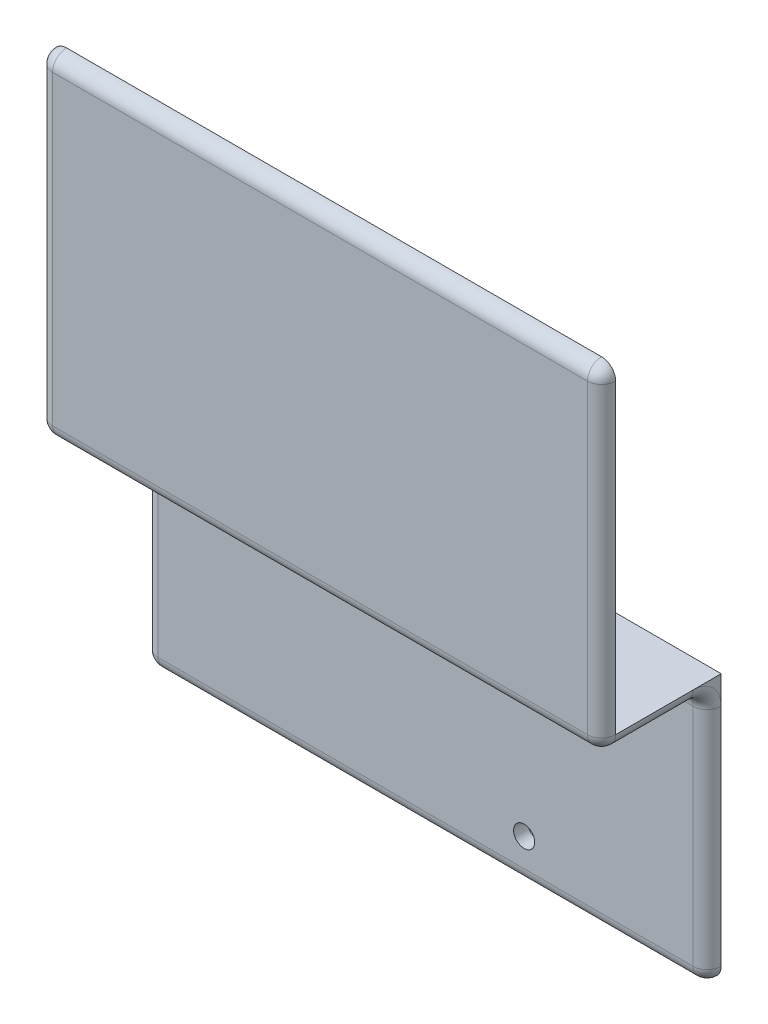
ISO-10303-21;
HEADER;
FILE_DESCRIPTION(('STEP AP214'),'2;1');
FILE_NAME('part.step','',(''),(''),'','','');
FILE_SCHEMA(('AUTOMOTIVE_DESIGN { 1 0 10303 214 1 1 1 1 }'));
ENDSEC;
DATA;
#1=APPLICATION_CONTEXT('core data for automotive mechanical design processes');
#2=APPLICATION_PROTOCOL_DEFINITION('international standard','automotive_design',2000,#1);
#3=PRODUCT_CONTEXT('',#1,'mechanical');
#4=PRODUCT('Part','Part','',(#3));
#5=PRODUCT_RELATED_PRODUCT_CATEGORY('part','',(#4));
#6=PRODUCT_DEFINITION_FORMATION('','',#4);
#7=PRODUCT_DEFINITION_CONTEXT('part definition',#1,'design');
#8=PRODUCT_DEFINITION('design','',#6,#7);
#9=PRODUCT_DEFINITION_SHAPE('','',#8);
#10=(LENGTH_UNIT() NAMED_UNIT(*) SI_UNIT(.MILLI.,.METRE.));
#11=(NAMED_UNIT(*) PLANE_ANGLE_UNIT() SI_UNIT($,.RADIAN.));
#12=(NAMED_UNIT(*) SI_UNIT($,.STERADIAN.) SOLID_ANGLE_UNIT());
#13=UNCERTAINTY_MEASURE_WITH_UNIT(LENGTH_MEASURE(1.E-05),#10,'distance_accuracy_value','');
#14=(GEOMETRIC_REPRESENTATION_CONTEXT(3) GLOBAL_UNCERTAINTY_ASSIGNED_CONTEXT((#13)) GLOBAL_UNIT_ASSIGNED_CONTEXT((#10,
#11,#12)) REPRESENTATION_CONTEXT('',''));
#15=CARTESIAN_POINT('',(0.,0.,0.));
#16=DIRECTION('',(0.,0.,1.));
#17=DIRECTION('',(1.,0.,0.));
#18=AXIS2_PLACEMENT_3D('',#15,#16,#17);
#19=CARTESIAN_POINT('',(40.,-41.75,17.));
#20=DIRECTION('',(-1.,0.,0.));
#21=DIRECTION('',(0.,0.,1.));
#22=AXIS2_PLACEMENT_3D('',#19,#20,#21);
#23=PLANE('',#22);
#24=CARTESIAN_POINT('',(40.,-7.75000000000001,4.));
#25=DIRECTION('',(-1.,0.,0.));
#26=DIRECTION('',(0.,0.,1.));
#27=AXIS2_PLACEMENT_3D('',#24,#25,#26);
#28=CIRCLE('',#27,4.);
#29=CARTESIAN_POINT('',(40.,-7.75000000000001,0.));
#30=VERTEX_POINT('',#29);
#31=CARTESIAN_POINT('',(40.,-3.75,4.));
#32=VERTEX_POINT('',#31);
#33=EDGE_CURVE('E299',#30,#32,#28,.F.);
#34=ORIENTED_EDGE('',*,*,#33,.F.);
#35=DIRECTION('',(0.,1.,0.));
#36=VECTOR('',#35,1.);
#37=CARTESIAN_POINT('',(40.,-41.75,0.));
#38=LINE('',#37,#36);
#39=CARTESIAN_POINT('',(40.,-3.75,0.));
#40=VERTEX_POINT('',#39);
#41=EDGE_CURVE('E244',#30,#40,#38,.T.);
#42=ORIENTED_EDGE('',*,*,#41,.T.);
#43=DIRECTION('',(0.,0.,-1.));
#44=VECTOR('',#43,1.);
#45=CARTESIAN_POINT('',(40.,-3.75,0.));
#46=LINE('',#45,#44);
#47=EDGE_CURVE('E215',#32,#40,#46,.T.);
#48=ORIENTED_EDGE('',*,*,#47,.F.);
#49=EDGE_LOOP('',(#34,#42,#48));
#50=FACE_BOUND('',#49,.T.);
#51=ADVANCED_FACE('F47',(#50),#23,.F.);
#52=CARTESIAN_POINT('',(-40.,-41.75,17.));
#53=DIRECTION('',(1.,0.,0.));
#54=DIRECTION('',(0.,0.,-1.));
#55=AXIS2_PLACEMENT_3D('',#52,#53,#54);
#56=PLANE('',#55);
#57=CARTESIAN_POINT('',(-40.,-7.75000000000001,4.));
#58=DIRECTION('',(1.,0.,0.));
#59=DIRECTION('',(0.,0.,-1.));
#60=AXIS2_PLACEMENT_3D('',#57,#58,#59);
#61=CIRCLE('',#60,4.);
#62=CARTESIAN_POINT('',(-40.,-3.75,4.));
#63=VERTEX_POINT('',#62);
#64=CARTESIAN_POINT('',(-40.,-7.75000000000001,0.));
#65=VERTEX_POINT('',#64);
#66=EDGE_CURVE('E286',#63,#65,#61,.F.);
#67=ORIENTED_EDGE('',*,*,#66,.F.);
#68=DIRECTION('',(0.,0.,-1.));
#69=VECTOR('',#68,1.);
#70=CARTESIAN_POINT('',(-40.,-3.75,17.));
#71=LINE('',#70,#69);
#72=CARTESIAN_POINT('',(-40.,-3.75,0.));
#73=VERTEX_POINT('',#72);
#74=EDGE_CURVE('E228',#63,#73,#71,.T.);
#75=ORIENTED_EDGE('',*,*,#74,.T.);
#76=DIRECTION('',(0.,-1.,0.));
#77=VECTOR('',#76,1.);
#78=CARTESIAN_POINT('',(-40.,-41.75,0.));
#79=LINE('',#78,#77);
#80=EDGE_CURVE('E237',#73,#65,#79,.T.);
#81=ORIENTED_EDGE('',*,*,#80,.T.);
#82=EDGE_LOOP('',(#67,#75,#81));
#83=FACE_BOUND('',#82,.T.);
#84=ADVANCED_FACE('F479',(#83),#56,.F.);
#85=CARTESIAN_POINT('',(0.,0.,17.));
#86=DIRECTION('',(0.,0.,1.));
#87=DIRECTION('',(1.,0.,0.));
#88=AXIS2_PLACEMENT_3D('',#85,#86,#87);
#89=PLANE('',#88);
#90=DIRECTION('',(-1.,0.,0.));
#91=VECTOR('',#90,1.);
#92=CARTESIAN_POINT('',(-40.,39.75,17.));
#93=LINE('',#92,#91);
#94=CARTESIAN_POINT('',(38.,39.75,17.));
#95=VERTEX_POINT('',#94);
#96=CARTESIAN_POINT('',(-38.,39.75,17.));
#97=VERTEX_POINT('',#96);
#98=EDGE_CURVE('E260',#95,#97,#93,.T.);
#99=ORIENTED_EDGE('',*,*,#98,.T.);
#100=DIRECTION('',(0.,-1.,0.));
#101=VECTOR('',#100,1.);
#102=CARTESIAN_POINT('',(-38.,-5.75000000000001,17.));
#103=LINE('',#102,#101);
#104=CARTESIAN_POINT('',(-38.,-3.75,17.));
#105=VERTEX_POINT('',#104);
#106=EDGE_CURVE('E264',#97,#105,#103,.T.);
#107=ORIENTED_EDGE('',*,*,#106,.T.);
#108=DIRECTION('',(-1.,0.,0.));
#109=VECTOR('',#108,1.);
#110=CARTESIAN_POINT('',(40.,-3.75,17.));
#111=LINE('',#110,#109);
#112=CARTESIAN_POINT('',(38.,-3.75,17.));
#113=VERTEX_POINT('',#112);
#114=EDGE_CURVE('E252',#105,#113,#111,.F.);
#115=ORIENTED_EDGE('',*,*,#114,.T.);
#116=DIRECTION('',(0.,1.,0.));
#117=VECTOR('',#116,1.);
#118=CARTESIAN_POINT('',(38.,41.75,17.));
#119=LINE('',#118,#117);
#120=EDGE_CURVE('E256',#113,#95,#119,.T.);
#121=ORIENTED_EDGE('',*,*,#120,.T.);
#122=EDGE_LOOP('',(#99,#107,#115,#121));
#123=FACE_BOUND('',#122,.T.);
#124=ADVANCED_FACE('F406',(#123),#89,.T.);
#125=CARTESIAN_POINT('',(0.,0.,0.));
#126=DIRECTION('',(0.,0.,1.));
#127=DIRECTION('',(1.,0.,0.));
#128=AXIS2_PLACEMENT_3D('',#125,#126,#127);
#129=PLANE('',#128);
#130=CARTESIAN_POINT('',(14.,-35.75,0.));
#131=DIRECTION('',(0.,0.,-1.));
#132=DIRECTION('',(-1.,0.,0.));
#133=AXIS2_PLACEMENT_3D('',#130,#131,#132);
#134=CIRCLE('',#133,1.5);
#135=CARTESIAN_POINT('',(12.5,-35.75,0.));
#136=VERTEX_POINT('',#135);
#137=EDGE_CURVE('E202',#136,#136,#134,.T.);
#138=ORIENTED_EDGE('',*,*,#137,.F.);
#139=EDGE_LOOP('',(#138));
#140=FACE_BOUND('',#139,.T.);
#141=DIRECTION('',(1.,0.,0.));
#142=VECTOR('',#141,1.);
#143=CARTESIAN_POINT('',(-22.1,-10.5,0.));
#144=LINE('',#143,#142);
#145=CARTESIAN_POINT('',(-22.1,-10.5,0.));
#146=VERTEX_POINT('',#145);
#147=CARTESIAN_POINT('',(-5.60000000000001,-10.5,0.));
#148=VERTEX_POINT('',#147);
#149=EDGE_CURVE('E200',#146,#148,#144,.T.);
#150=ORIENTED_EDGE('',*,*,#149,.F.);
#151=DIRECTION('',(0.,1.,0.));
#152=VECTOR('',#151,1.);
#153=CARTESIAN_POINT('',(-22.1,-10.5,0.));
#154=LINE('',#153,#152);
#155=CARTESIAN_POINT('',(-22.1,-14.5,0.));
#156=VERTEX_POINT('',#155);
#157=EDGE_CURVE('E176',#156,#146,#154,.T.);
#158=ORIENTED_EDGE('',*,*,#157,.F.);
#159=DIRECTION('',(-1.,0.,0.));
#160=VECTOR('',#159,1.);
#161=CARTESIAN_POINT('',(-22.1,-14.5,0.));
#162=LINE('',#161,#160);
#163=CARTESIAN_POINT('',(-5.60000000000001,-14.5,0.));
#164=VERTEX_POINT('',#163);
#165=EDGE_CURVE('E186',#164,#156,#162,.T.);
#166=ORIENTED_EDGE('',*,*,#165,.F.);
#167=DIRECTION('',(0.,-1.,0.));
#168=VECTOR('',#167,1.);
#169=CARTESIAN_POINT('',(-5.60000000000001,-10.5,0.));
#170=LINE('',#169,#168);
#171=EDGE_CURVE('E193',#148,#164,#170,.T.);
#172=ORIENTED_EDGE('',*,*,#171,.F.);
#173=EDGE_LOOP('',(#150,#158,#166,#172));
#174=FACE_BOUND('',#173,.T.);
#175=DIRECTION('',(1.,0.,0.));
#176=VECTOR('',#175,1.);
#177=CARTESIAN_POINT('',(-40.,-41.75,0.));
#178=LINE('',#177,#176);
#179=CARTESIAN_POINT('',(-38.,-41.75,0.));
#180=VERTEX_POINT('',#179);
#181=CARTESIAN_POINT('',(38.,-41.75,0.));
#182=VERTEX_POINT('',#181);
#183=EDGE_CURVE('E241',#180,#182,#178,.T.);
#184=ORIENTED_EDGE('',*,*,#183,.F.);
#185=CARTESIAN_POINT('',(-38.,-39.75,0.));
#186=DIRECTION('',(0.,0.,1.));
#187=DIRECTION('',(1.,0.,0.));
#188=AXIS2_PLACEMENT_3D('',#185,#186,#187);
#189=CIRCLE('',#188,2.);
#190=CARTESIAN_POINT('',(-40.,-39.75,0.));
#191=VERTEX_POINT('',#190);
#192=EDGE_CURVE('E382',#180,#191,#189,.F.);
#193=ORIENTED_EDGE('',*,*,#192,.T.);
#194=EDGE_CURVE('E236',#65,#191,#79,.T.);
#195=ORIENTED_EDGE('',*,*,#194,.F.);
#196=ORIENTED_EDGE('',*,*,#80,.F.);
#197=DIRECTION('',(1.,0.,0.));
#198=VECTOR('',#197,1.);
#199=CARTESIAN_POINT('',(0.,-3.75,0.));
#200=LINE('',#199,#198);
#201=EDGE_CURVE('E248',#73,#40,#200,.T.);
#202=ORIENTED_EDGE('',*,*,#201,.T.);
#203=ORIENTED_EDGE('',*,*,#41,.F.);
#204=CARTESIAN_POINT('',(40.,-39.75,0.));
#205=VERTEX_POINT('',#204);
#206=EDGE_CURVE('E245',#205,#30,#38,.T.);
#207=ORIENTED_EDGE('',*,*,#206,.F.);
#208=CARTESIAN_POINT('',(38.,-39.75,0.));
#209=DIRECTION('',(0.,0.,1.));
#210=DIRECTION('',(1.,0.,0.));
#211=AXIS2_PLACEMENT_3D('',#208,#209,#210);
#212=CIRCLE('',#211,2.);
#213=EDGE_CURVE('E371',#205,#182,#212,.F.);
#214=ORIENTED_EDGE('',*,*,#213,.T.);
#215=EDGE_LOOP('',(#184,#193,#195,#196,#202,#203,#207,#214));
#216=FACE_BOUND('',#215,.T.);
#217=ADVANCED_FACE('F197',(#140,#174,#216),#129,.F.);
#218=CARTESIAN_POINT('',(-40.5,41.75,15.));
#219=DIRECTION('',(0.,0.,1.));
#220=DIRECTION('',(0.,-1.,0.));
#221=AXIS2_PLACEMENT_3D('',#218,#219,#220);
#222=PLANE('',#221);
#223=DIRECTION('',(0.,-1.,0.));
#224=VECTOR('',#223,1.);
#225=CARTESIAN_POINT('',(-40.,-41.75,15.));
#226=LINE('',#225,#224);
#227=CARTESIAN_POINT('',(-40.,39.75,15.));
#228=VERTEX_POINT('',#227);
#229=CARTESIAN_POINT('',(-40.,-3.75,15.));
#230=VERTEX_POINT('',#229);
#231=EDGE_CURVE('E233',#228,#230,#226,.T.);
#232=ORIENTED_EDGE('',*,*,#231,.F.);
#233=CARTESIAN_POINT('',(-38.,39.75,15.));
#234=DIRECTION('',(0.,0.,1.));
#235=DIRECTION('',(0.,-1.,0.));
#236=AXIS2_PLACEMENT_3D('',#233,#234,#235);
#237=CIRCLE('',#236,2.);
#238=CARTESIAN_POINT('',(-38.,41.75,15.));
#239=VERTEX_POINT('',#238);
#240=EDGE_CURVE('E391',#228,#239,#237,.F.);
#241=ORIENTED_EDGE('',*,*,#240,.T.);
#242=DIRECTION('',(1.,0.,0.));
#243=VECTOR('',#242,1.);
#244=CARTESIAN_POINT('',(-40.5,41.75,15.));
#245=LINE('',#244,#243);
#246=CARTESIAN_POINT('',(38.,41.75,15.));
#247=VERTEX_POINT('',#246);
#248=EDGE_CURVE('E212',#239,#247,#245,.T.);
#249=ORIENTED_EDGE('',*,*,#248,.T.);
#250=CARTESIAN_POINT('',(38.,39.75,15.));
#251=DIRECTION('',(0.,0.,1.));
#252=DIRECTION('',(0.,-1.,0.));
#253=AXIS2_PLACEMENT_3D('',#250,#251,#252);
#254=CIRCLE('',#253,2.);
#255=CARTESIAN_POINT('',(40.,39.75,15.));
#256=VERTEX_POINT('',#255);
#257=EDGE_CURVE('E63',#247,#256,#254,.F.);
#258=ORIENTED_EDGE('',*,*,#257,.T.);
#259=DIRECTION('',(0.,-1.,0.));
#260=VECTOR('',#259,1.);
#261=CARTESIAN_POINT('',(40.,41.75,15.));
#262=LINE('',#261,#260);
#263=CARTESIAN_POINT('',(40.,-3.75,15.));
#264=VERTEX_POINT('',#263);
#265=EDGE_CURVE('E225',#256,#264,#262,.T.);
#266=ORIENTED_EDGE('',*,*,#265,.T.);
#267=DIRECTION('',(1.,0.,0.));
#268=VECTOR('',#267,1.);
#269=CARTESIAN_POINT('',(-40.5,-3.75,15.));
#270=LINE('',#269,#268);
#271=EDGE_CURVE('E216',#230,#264,#270,.T.);
#272=ORIENTED_EDGE('',*,*,#271,.F.);
#273=EDGE_LOOP('',(#232,#241,#249,#258,#266,#272));
#274=FACE_BOUND('',#273,.T.);
#275=ADVANCED_FACE('F414',(#274),#222,.F.);
#276=CARTESIAN_POINT('',(-40.5,-3.75,0.));
#277=DIRECTION('',(0.,-1.,0.));
#278=DIRECTION('',(0.,0.,-1.));
#279=AXIS2_PLACEMENT_3D('',#276,#277,#278);
#280=PLANE('',#279);
#281=ORIENTED_EDGE('',*,*,#271,.T.);
#282=EDGE_CURVE('E221',#264,#32,#46,.T.);
#283=ORIENTED_EDGE('',*,*,#282,.T.);
#284=ORIENTED_EDGE('',*,*,#47,.T.);
#285=ORIENTED_EDGE('',*,*,#201,.F.);
#286=ORIENTED_EDGE('',*,*,#74,.F.);
#287=EDGE_CURVE('E229',#230,#63,#71,.T.);
#288=ORIENTED_EDGE('',*,*,#287,.F.);
#289=EDGE_LOOP('',(#281,#283,#284,#285,#286,#288));
#290=FACE_BOUND('',#289,.T.);
#291=ADVANCED_FACE('F420',(#290),#280,.F.);
#292=CARTESIAN_POINT('',(-40.5,-41.75,2.));
#293=DIRECTION('',(0.,0.,-1.));
#294=DIRECTION('',(-1.,0.,0.));
#295=AXIS2_PLACEMENT_3D('',#292,#293,#294);
#296=PLANE('',#295);
#297=CARTESIAN_POINT('',(14.,-35.75,2.));
#298=DIRECTION('',(0.,0.,-1.));
#299=DIRECTION('',(-1.,0.,0.));
#300=AXIS2_PLACEMENT_3D('',#297,#298,#299);
#301=CIRCLE('',#300,1.5);
#302=CARTESIAN_POINT('',(12.5,-35.75,2.));
#303=VERTEX_POINT('',#302);
#304=EDGE_CURVE('E207',#303,#303,#301,.T.);
#305=ORIENTED_EDGE('',*,*,#304,.T.);
#306=EDGE_LOOP('',(#305));
#307=FACE_BOUND('',#306,.T.);
#308=DIRECTION('',(-1.,0.,0.));
#309=VECTOR('',#308,1.);
#310=CARTESIAN_POINT('',(-40.5,-14.5,2.));
#311=LINE('',#310,#309);
#312=CARTESIAN_POINT('',(-5.60000000000001,-14.5,2.));
#313=VERTEX_POINT('',#312);
#314=CARTESIAN_POINT('',(-22.1,-14.5,2.));
#315=VERTEX_POINT('',#314);
#316=EDGE_CURVE('E356',#313,#315,#311,.T.);
#317=ORIENTED_EDGE('',*,*,#316,.T.);
#318=DIRECTION('',(0.,1.,0.));
#319=VECTOR('',#318,1.);
#320=CARTESIAN_POINT('',(-22.1,-41.75,2.));
#321=LINE('',#320,#319);
#322=CARTESIAN_POINT('',(-22.1,-10.5,2.));
#323=VERTEX_POINT('',#322);
#324=EDGE_CURVE('E179',#315,#323,#321,.T.);
#325=ORIENTED_EDGE('',*,*,#324,.T.);
#326=DIRECTION('',(1.,0.,0.));
#327=VECTOR('',#326,1.);
#328=CARTESIAN_POINT('',(-40.5,-10.5,2.));
#329=LINE('',#328,#327);
#330=CARTESIAN_POINT('',(-5.60000000000001,-10.5,2.));
#331=VERTEX_POINT('',#330);
#332=EDGE_CURVE('E317',#323,#331,#329,.T.);
#333=ORIENTED_EDGE('',*,*,#332,.T.);
#334=DIRECTION('',(0.,-1.,0.));
#335=VECTOR('',#334,1.);
#336=CARTESIAN_POINT('',(-5.60000000000001,-41.75,2.));
#337=LINE('',#336,#335);
#338=EDGE_CURVE('E352',#331,#313,#337,.T.);
#339=ORIENTED_EDGE('',*,*,#338,.T.);
#340=EDGE_LOOP('',(#317,#325,#333,#339));
#341=FACE_BOUND('',#340,.T.);
#342=DIRECTION('',(1.,0.,0.));
#343=VECTOR('',#342,1.);
#344=CARTESIAN_POINT('',(-40.,-7.75000000000001,2.));
#345=LINE('',#344,#343);
#346=CARTESIAN_POINT('',(38.,-7.75000000000001,2.));
#347=VERTEX_POINT('',#346);
#348=CARTESIAN_POINT('',(-38.,-7.75000000000001,2.));
#349=VERTEX_POINT('',#348);
#350=EDGE_CURVE('E310',#347,#349,#345,.F.);
#351=ORIENTED_EDGE('',*,*,#350,.T.);
#352=DIRECTION('',(0.,1.,0.));
#353=VECTOR('',#352,1.);
#354=CARTESIAN_POINT('',(-38.,-41.75,2.));
#355=LINE('',#354,#353);
#356=CARTESIAN_POINT('',(-38.,-39.75,2.));
#357=VERTEX_POINT('',#356);
#358=EDGE_CURVE('E313',#349,#357,#355,.F.);
#359=ORIENTED_EDGE('',*,*,#358,.T.);
#360=DIRECTION('',(1.,0.,0.));
#361=VECTOR('',#360,1.);
#362=CARTESIAN_POINT('',(-40.5,-39.75,2.));
#363=LINE('',#362,#361);
#364=CARTESIAN_POINT('',(38.,-39.75,2.));
#365=VERTEX_POINT('',#364);
#366=EDGE_CURVE('E303',#357,#365,#363,.T.);
#367=ORIENTED_EDGE('',*,*,#366,.T.);
#368=DIRECTION('',(0.,1.,0.));
#369=VECTOR('',#368,1.);
#370=CARTESIAN_POINT('',(38.,-41.75,2.));
#371=LINE('',#370,#369);
#372=EDGE_CURVE('E307',#365,#347,#371,.T.);
#373=ORIENTED_EDGE('',*,*,#372,.T.);
#374=EDGE_LOOP('',(#351,#359,#367,#373));
#375=FACE_BOUND('',#374,.T.);
#376=ADVANCED_FACE('F451',(#307,#341,#375),#296,.F.);
#377=CARTESIAN_POINT('',(-40.5,-5.75000000000001,17.));
#378=DIRECTION('',(0.,1.,0.));
#379=DIRECTION('',(0.,0.,1.));
#380=AXIS2_PLACEMENT_3D('',#377,#378,#379);
#381=PLANE('',#380);
#382=DIRECTION('',(-1.,0.,0.));
#383=VECTOR('',#382,1.);
#384=CARTESIAN_POINT('',(-40.,-5.75000000000001,15.));
#385=LINE('',#384,#383);
#386=CARTESIAN_POINT('',(38.,-5.75000000000001,15.));
#387=VERTEX_POINT('',#386);
#388=CARTESIAN_POINT('',(-38.,-5.75000000000001,15.));
#389=VERTEX_POINT('',#388);
#390=EDGE_CURVE('E268',#387,#389,#385,.T.);
#391=ORIENTED_EDGE('',*,*,#390,.T.);
#392=DIRECTION('',(0.,0.,1.));
#393=VECTOR('',#392,1.);
#394=CARTESIAN_POINT('',(-38.,-5.75000000000001,17.));
#395=LINE('',#394,#393);
#396=CARTESIAN_POINT('',(-38.,-5.75000000000001,4.));
#397=VERTEX_POINT('',#396);
#398=EDGE_CURVE('E296',#389,#397,#395,.F.);
#399=ORIENTED_EDGE('',*,*,#398,.T.);
#400=DIRECTION('',(1.,0.,0.));
#401=VECTOR('',#400,1.);
#402=CARTESIAN_POINT('',(40.,-5.75000000000001,4.));
#403=LINE('',#402,#401);
#404=CARTESIAN_POINT('',(38.,-5.75000000000001,4.));
#405=VERTEX_POINT('',#404);
#406=EDGE_CURVE('E290',#397,#405,#403,.T.);
#407=ORIENTED_EDGE('',*,*,#406,.T.);
#408=DIRECTION('',(0.,0.,1.));
#409=VECTOR('',#408,1.);
#410=CARTESIAN_POINT('',(38.,-5.75000000000001,17.));
#411=LINE('',#410,#409);
#412=EDGE_CURVE('E293',#405,#387,#411,.T.);
#413=ORIENTED_EDGE('',*,*,#412,.T.);
#414=EDGE_LOOP('',(#391,#399,#407,#413));
#415=FACE_BOUND('',#414,.T.);
#416=ADVANCED_FACE('F434',(#415),#381,.F.);
#417=CARTESIAN_POINT('',(38.,0.,15.));
#418=DIRECTION('',(0.,-1.,0.));
#419=DIRECTION('',(0.,0.,-1.));
#420=AXIS2_PLACEMENT_3D('',#417,#418,#419);
#421=CYLINDRICAL_SURFACE('',#420,2.);
#422=ORIENTED_EDGE('',*,*,#265,.F.);
#423=CARTESIAN_POINT('',(38.,39.75,15.));
#424=DIRECTION('',(0.,-1.,0.));
#425=DIRECTION('',(0.,0.,-1.));
#426=AXIS2_PLACEMENT_3D('',#423,#424,#425);
#427=CIRCLE('',#426,2.);
#428=EDGE_CURVE('E11',#256,#95,#427,.T.);
#429=ORIENTED_EDGE('',*,*,#428,.T.);
#430=ORIENTED_EDGE('',*,*,#120,.F.);
#431=CARTESIAN_POINT('',(38.,-3.75,15.));
#432=DIRECTION('',(0.,-1.,0.));
#433=DIRECTION('',(0.,0.,-1.));
#434=AXIS2_PLACEMENT_3D('',#431,#432,#433);
#435=CIRCLE('',#434,2.);
#436=EDGE_CURVE('E282',#113,#264,#435,.F.);
#437=ORIENTED_EDGE('',*,*,#436,.T.);
#438=EDGE_LOOP('',(#422,#429,#430,#437));
#439=FACE_BOUND('',#438,.T.);
#440=ADVANCED_FACE('F507',(#439),#421,.T.);
#441=CARTESIAN_POINT('',(0.,39.75,15.));
#442=DIRECTION('',(1.,0.,0.));
#443=DIRECTION('',(0.,0.,-1.));
#444=AXIS2_PLACEMENT_3D('',#441,#442,#443);
#445=CYLINDRICAL_SURFACE('',#444,2.);
#446=ORIENTED_EDGE('',*,*,#248,.F.);
#447=CARTESIAN_POINT('',(-38.,39.75,15.));
#448=DIRECTION('',(1.,0.,0.));
#449=DIRECTION('',(0.,0.,-1.));
#450=AXIS2_PLACEMENT_3D('',#447,#448,#449);
#451=CIRCLE('',#450,2.);
#452=EDGE_CURVE('E56',#239,#97,#451,.T.);
#453=ORIENTED_EDGE('',*,*,#452,.T.);
#454=ORIENTED_EDGE('',*,*,#98,.F.);
#455=CARTESIAN_POINT('',(38.,39.75,15.));
#456=DIRECTION('',(1.,0.,0.));
#457=DIRECTION('',(0.,0.,-1.));
#458=AXIS2_PLACEMENT_3D('',#455,#456,#457);
#459=CIRCLE('',#458,2.);
#460=EDGE_CURVE('E394',#95,#247,#459,.F.);
#461=ORIENTED_EDGE('',*,*,#460,.T.);
#462=EDGE_LOOP('',(#446,#453,#454,#461));
#463=FACE_BOUND('',#462,.T.);
#464=ADVANCED_FACE('F401',(#463),#445,.T.);
#465=CARTESIAN_POINT('',(-40.5,-3.75,15.));
#466=DIRECTION('',(1.,0.,0.));
#467=DIRECTION('',(0.,0.,-1.));
#468=AXIS2_PLACEMENT_3D('',#465,#466,#467);
#469=CYLINDRICAL_SURFACE('',#468,2.);
#470=ORIENTED_EDGE('',*,*,#114,.F.);
#471=CARTESIAN_POINT('',(-38.,-3.75,15.));
#472=DIRECTION('',(1.,0.,0.));
#473=DIRECTION('',(0.,0.,-1.));
#474=AXIS2_PLACEMENT_3D('',#471,#472,#473);
#475=CIRCLE('',#474,2.);
#476=EDGE_CURVE('E279',#105,#389,#475,.T.);
#477=ORIENTED_EDGE('',*,*,#476,.T.);
#478=ORIENTED_EDGE('',*,*,#390,.F.);
#479=CARTESIAN_POINT('',(38.,-3.75,15.));
#480=DIRECTION('',(1.,0.,0.));
#481=DIRECTION('',(0.,0.,-1.));
#482=AXIS2_PLACEMENT_3D('',#479,#480,#481);
#483=CIRCLE('',#482,2.);
#484=EDGE_CURVE('E276',#387,#113,#483,.F.);
#485=ORIENTED_EDGE('',*,*,#484,.T.);
#486=EDGE_LOOP('',(#470,#477,#478,#485));
#487=FACE_BOUND('',#486,.T.);
#488=ADVANCED_FACE('F431',(#487),#469,.T.);
#489=CARTESIAN_POINT('',(-38.,0.,15.));
#490=DIRECTION('',(0.,1.,0.));
#491=DIRECTION('',(0.,0.,1.));
#492=AXIS2_PLACEMENT_3D('',#489,#490,#491);
#493=CYLINDRICAL_SURFACE('',#492,2.);
#494=ORIENTED_EDGE('',*,*,#106,.F.);
#495=CARTESIAN_POINT('',(-38.,39.75,15.));
#496=DIRECTION('',(0.,1.,0.));
#497=DIRECTION('',(0.,0.,1.));
#498=AXIS2_PLACEMENT_3D('',#495,#496,#497);
#499=CIRCLE('',#498,2.);
#500=EDGE_CURVE('E385',#97,#228,#499,.F.);
#501=ORIENTED_EDGE('',*,*,#500,.T.);
#502=ORIENTED_EDGE('',*,*,#231,.T.);
#503=CARTESIAN_POINT('',(-38.,-3.75,15.));
#504=DIRECTION('',(0.,1.,0.));
#505=DIRECTION('',(0.,0.,1.));
#506=AXIS2_PLACEMENT_3D('',#503,#504,#505);
#507=CIRCLE('',#506,2.);
#508=EDGE_CURVE('E272',#230,#105,#507,.T.);
#509=ORIENTED_EDGE('',*,*,#508,.T.);
#510=EDGE_LOOP('',(#494,#501,#502,#509));
#511=FACE_BOUND('',#510,.T.);
#512=ADVANCED_FACE('F409',(#511),#493,.T.);
#513=CARTESIAN_POINT('',(38.,-3.75,15.));
#514=DIRECTION('',(0.,0.,1.));
#515=DIRECTION('',(1.,0.,0.));
#516=AXIS2_PLACEMENT_3D('',#513,#514,#515);
#517=SPHERICAL_SURFACE('',#516,2.);
#518=ORIENTED_EDGE('',*,*,#436,.F.);
#519=ORIENTED_EDGE('',*,*,#484,.F.);
#520=CARTESIAN_POINT('',(38.,-3.75,15.));
#521=DIRECTION('',(0.,0.,-1.));
#522=DIRECTION('',(-1.,0.,0.));
#523=AXIS2_PLACEMENT_3D('',#520,#521,#522);
#524=CIRCLE('',#523,2.);
#525=EDGE_CURVE('E220',#264,#387,#524,.T.);
#526=ORIENTED_EDGE('',*,*,#525,.F.);
#527=EDGE_LOOP('',(#518,#519,#526));
#528=FACE_BOUND('',#527,.T.);
#529=ADVANCED_FACE('F502',(#528),#517,.T.);
#530=CARTESIAN_POINT('',(38.,-3.75,17.));
#531=DIRECTION('',(0.,0.,1.));
#532=DIRECTION('',(1.,0.,0.));
#533=AXIS2_PLACEMENT_3D('',#530,#531,#532);
#534=CYLINDRICAL_SURFACE('',#533,2.);
#535=ORIENTED_EDGE('',*,*,#525,.T.);
#536=ORIENTED_EDGE('',*,*,#412,.F.);
#537=CARTESIAN_POINT('',(38.,-3.75,4.));
#538=DIRECTION('',(0.,0.,-1.));
#539=DIRECTION('',(-1.,0.,0.));
#540=AXIS2_PLACEMENT_3D('',#537,#538,#539);
#541=CIRCLE('',#540,2.);
#542=EDGE_CURVE('E342',#32,#405,#541,.T.);
#543=ORIENTED_EDGE('',*,*,#542,.F.);
#544=ORIENTED_EDGE('',*,*,#282,.F.);
#545=EDGE_LOOP('',(#535,#536,#543,#544));
#546=FACE_BOUND('',#545,.T.);
#547=ADVANCED_FACE('F439',(#546),#534,.T.);
#548=CARTESIAN_POINT('',(38.,-41.75,0.));
#549=DIRECTION('',(0.,1.,0.));
#550=DIRECTION('',(0.,0.,1.));
#551=AXIS2_PLACEMENT_3D('',#548,#549,#550);
#552=CYLINDRICAL_SURFACE('',#551,2.);
#553=ORIENTED_EDGE('',*,*,#372,.F.);
#554=CARTESIAN_POINT('',(38.,-39.75,0.));
#555=DIRECTION('',(0.,1.,0.));
#556=DIRECTION('',(0.,0.,1.));
#557=AXIS2_PLACEMENT_3D('',#554,#555,#556);
#558=CIRCLE('',#557,2.);
#559=EDGE_CURVE('E368',#365,#205,#558,.T.);
#560=ORIENTED_EDGE('',*,*,#559,.T.);
#561=ORIENTED_EDGE('',*,*,#206,.T.);
#562=CARTESIAN_POINT('',(38.,-7.75000000000001,0.));
#563=DIRECTION('',(0.,1.,0.));
#564=DIRECTION('',(0.,0.,1.));
#565=AXIS2_PLACEMENT_3D('',#562,#563,#564);
#566=CIRCLE('',#565,2.);
#567=EDGE_CURVE('E338',#347,#30,#566,.T.);
#568=ORIENTED_EDGE('',*,*,#567,.F.);
#569=EDGE_LOOP('',(#553,#560,#561,#568));
#570=FACE_BOUND('',#569,.T.);
#571=ADVANCED_FACE('F467',(#570),#552,.T.);
#572=CARTESIAN_POINT('',(38.,-7.75000000000001,4.));
#573=DIRECTION('',(-1.,0.,0.));
#574=DIRECTION('',(0.,0.,1.));
#575=AXIS2_PLACEMENT_3D('',#572,#573,#574);
#576=TOROIDAL_SURFACE('',#575,4.,2.);
#577=ORIENTED_EDGE('',*,*,#33,.T.);
#578=ORIENTED_EDGE('',*,*,#542,.T.);
#579=CARTESIAN_POINT('',(38.,-7.75000000000001,4.));
#580=DIRECTION('',(-1.,0.,0.));
#581=DIRECTION('',(0.,0.,1.));
#582=AXIS2_PLACEMENT_3D('',#579,#580,#581);
#583=CIRCLE('',#582,2.);
#584=EDGE_CURVE('E334',#347,#405,#583,.F.);
#585=ORIENTED_EDGE('',*,*,#584,.F.);
#586=ORIENTED_EDGE('',*,*,#567,.T.);
#587=EDGE_LOOP('',(#577,#578,#585,#586));
#588=FACE_BOUND('',#587,.T.);
#589=ADVANCED_FACE('F443',(#588),#576,.T.);
#590=CARTESIAN_POINT('',(-40.5,-39.75,0.));
#591=DIRECTION('',(1.,0.,0.));
#592=DIRECTION('',(0.,1.,0.));
#593=AXIS2_PLACEMENT_3D('',#590,#591,#592);
#594=CYLINDRICAL_SURFACE('',#593,2.);
#595=ORIENTED_EDGE('',*,*,#366,.F.);
#596=CARTESIAN_POINT('',(-38.,-39.75,0.));
#597=DIRECTION('',(1.,0.,0.));
#598=DIRECTION('',(0.,1.,0.));
#599=AXIS2_PLACEMENT_3D('',#596,#597,#598);
#600=CIRCLE('',#599,2.);
#601=EDGE_CURVE('E379',#357,#180,#600,.T.);
#602=ORIENTED_EDGE('',*,*,#601,.T.);
#603=ORIENTED_EDGE('',*,*,#183,.T.);
#604=CARTESIAN_POINT('',(38.,-39.75,0.));
#605=DIRECTION('',(1.,0.,0.));
#606=DIRECTION('',(0.,1.,0.));
#607=AXIS2_PLACEMENT_3D('',#604,#605,#606);
#608=CIRCLE('',#607,2.);
#609=EDGE_CURVE('E361',#182,#365,#608,.F.);
#610=ORIENTED_EDGE('',*,*,#609,.T.);
#611=EDGE_LOOP('',(#595,#602,#603,#610));
#612=FACE_BOUND('',#611,.T.);
#613=ADVANCED_FACE('F463',(#612),#594,.T.);
#614=CARTESIAN_POINT('',(-40.5,-7.75000000000001,4.));
#615=DIRECTION('',(-1.,0.,0.));
#616=DIRECTION('',(0.,0.,1.));
#617=AXIS2_PLACEMENT_3D('',#614,#615,#616);
#618=CYLINDRICAL_SURFACE('',#617,2.);
#619=ORIENTED_EDGE('',*,*,#584,.T.);
#620=ORIENTED_EDGE('',*,*,#406,.F.);
#621=CARTESIAN_POINT('',(-38.,-7.75000000000001,4.));
#622=DIRECTION('',(1.,0.,0.));
#623=DIRECTION('',(0.,0.,-1.));
#624=AXIS2_PLACEMENT_3D('',#621,#622,#623);
#625=CIRCLE('',#624,2.);
#626=EDGE_CURVE('E330',#349,#397,#625,.T.);
#627=ORIENTED_EDGE('',*,*,#626,.F.);
#628=ORIENTED_EDGE('',*,*,#350,.F.);
#629=EDGE_LOOP('',(#619,#620,#627,#628));
#630=FACE_BOUND('',#629,.T.);
#631=ADVANCED_FACE('F447',(#630),#618,.F.);
#632=CARTESIAN_POINT('',(-38.,-41.75,0.));
#633=DIRECTION('',(0.,1.,0.));
#634=DIRECTION('',(0.,0.,1.));
#635=AXIS2_PLACEMENT_3D('',#632,#633,#634);
#636=CYLINDRICAL_SURFACE('',#635,2.);
#637=ORIENTED_EDGE('',*,*,#194,.T.);
#638=CARTESIAN_POINT('',(-38.,-39.75,0.));
#639=DIRECTION('',(0.,1.,0.));
#640=DIRECTION('',(0.,0.,1.));
#641=AXIS2_PLACEMENT_3D('',#638,#639,#640);
#642=CIRCLE('',#641,2.);
#643=EDGE_CURVE('E375',#191,#357,#642,.T.);
#644=ORIENTED_EDGE('',*,*,#643,.T.);
#645=ORIENTED_EDGE('',*,*,#358,.F.);
#646=CARTESIAN_POINT('',(-38.,-7.75000000000001,0.));
#647=DIRECTION('',(0.,1.,0.));
#648=DIRECTION('',(0.,0.,1.));
#649=AXIS2_PLACEMENT_3D('',#646,#647,#648);
#650=CIRCLE('',#649,2.);
#651=EDGE_CURVE('E326',#65,#349,#650,.T.);
#652=ORIENTED_EDGE('',*,*,#651,.F.);
#653=EDGE_LOOP('',(#637,#644,#645,#652));
#654=FACE_BOUND('',#653,.T.);
#655=ADVANCED_FACE('F457',(#654),#636,.T.);
#656=CARTESIAN_POINT('',(-38.,-7.75000000000001,4.));
#657=DIRECTION('',(1.,0.,0.));
#658=DIRECTION('',(0.,0.,-1.));
#659=AXIS2_PLACEMENT_3D('',#656,#657,#658);
#660=TOROIDAL_SURFACE('',#659,4.,2.);
#661=ORIENTED_EDGE('',*,*,#651,.T.);
#662=ORIENTED_EDGE('',*,*,#626,.T.);
#663=CARTESIAN_POINT('',(-38.,-3.75,4.));
#664=DIRECTION('',(0.,0.,-1.));
#665=DIRECTION('',(-1.,0.,0.));
#666=AXIS2_PLACEMENT_3D('',#663,#664,#665);
#667=CIRCLE('',#666,2.);
#668=EDGE_CURVE('E322',#63,#397,#667,.F.);
#669=ORIENTED_EDGE('',*,*,#668,.F.);
#670=ORIENTED_EDGE('',*,*,#66,.T.);
#671=EDGE_LOOP('',(#661,#662,#669,#670));
#672=FACE_BOUND('',#671,.T.);
#673=ADVANCED_FACE('F481',(#672),#660,.T.);
#674=CARTESIAN_POINT('',(-38.,-3.75,17.));
#675=DIRECTION('',(0.,0.,1.));
#676=DIRECTION('',(1.,0.,0.));
#677=AXIS2_PLACEMENT_3D('',#674,#675,#676);
#678=CYLINDRICAL_SURFACE('',#677,2.);
#679=ORIENTED_EDGE('',*,*,#668,.T.);
#680=ORIENTED_EDGE('',*,*,#398,.F.);
#681=CARTESIAN_POINT('',(-38.,-3.75,15.));
#682=DIRECTION('',(0.,0.,1.));
#683=DIRECTION('',(1.,0.,0.));
#684=AXIS2_PLACEMENT_3D('',#681,#682,#683);
#685=CIRCLE('',#684,2.);
#686=EDGE_CURVE('E318',#230,#389,#685,.T.);
#687=ORIENTED_EDGE('',*,*,#686,.F.);
#688=ORIENTED_EDGE('',*,*,#287,.T.);
#689=EDGE_LOOP('',(#679,#680,#687,#688));
#690=FACE_BOUND('',#689,.T.);
#691=ADVANCED_FACE('F425',(#690),#678,.T.);
#692=CARTESIAN_POINT('',(-38.,-3.75,15.));
#693=DIRECTION('',(0.,0.,1.));
#694=DIRECTION('',(1.,0.,0.));
#695=AXIS2_PLACEMENT_3D('',#692,#693,#694);
#696=SPHERICAL_SURFACE('',#695,2.);
#697=ORIENTED_EDGE('',*,*,#686,.T.);
#698=ORIENTED_EDGE('',*,*,#476,.F.);
#699=ORIENTED_EDGE('',*,*,#508,.F.);
#700=EDGE_LOOP('',(#697,#698,#699));
#701=FACE_BOUND('',#700,.T.);
#702=ADVANCED_FACE('F428',(#701),#696,.T.);
#703=CARTESIAN_POINT('',(-22.1,-10.5,80.5));
#704=DIRECTION('',(-1.,0.,0.));
#705=DIRECTION('',(0.,0.,1.));
#706=AXIS2_PLACEMENT_3D('',#703,#704,#705);
#707=PLANE('',#706);
#708=DIRECTION('',(0.,0.,-1.));
#709=VECTOR('',#708,1.);
#710=CARTESIAN_POINT('',(-22.1,-14.5,80.5));
#711=LINE('',#710,#709);
#712=EDGE_CURVE('E171',#315,#156,#711,.T.);
#713=ORIENTED_EDGE('',*,*,#712,.T.);
#714=ORIENTED_EDGE('',*,*,#157,.T.);
#715=DIRECTION('',(0.,0.,-1.));
#716=VECTOR('',#715,1.);
#717=CARTESIAN_POINT('',(-22.1,-10.5,80.5));
#718=LINE('',#717,#716);
#719=EDGE_CURVE('E194',#323,#146,#718,.T.);
#720=ORIENTED_EDGE('',*,*,#719,.F.);
#721=ORIENTED_EDGE('',*,*,#324,.F.);
#722=EDGE_LOOP('',(#713,#714,#720,#721));
#723=FACE_BOUND('',#722,.T.);
#724=ADVANCED_FACE('F173',(#723),#707,.F.);
#725=CARTESIAN_POINT('',(-22.1,-14.5,80.5));
#726=DIRECTION('',(0.,-1.,0.));
#727=DIRECTION('',(0.,0.,-1.));
#728=AXIS2_PLACEMENT_3D('',#725,#726,#727);
#729=PLANE('',#728);
#730=DIRECTION('',(0.,0.,-1.));
#731=VECTOR('',#730,1.);
#732=CARTESIAN_POINT('',(-5.60000000000001,-14.5,80.5));
#733=LINE('',#732,#731);
#734=EDGE_CURVE('E183',#313,#164,#733,.T.);
#735=ORIENTED_EDGE('',*,*,#734,.T.);
#736=ORIENTED_EDGE('',*,*,#165,.T.);
#737=ORIENTED_EDGE('',*,*,#712,.F.);
#738=ORIENTED_EDGE('',*,*,#316,.F.);
#739=EDGE_LOOP('',(#735,#736,#737,#738));
#740=FACE_BOUND('',#739,.T.);
#741=ADVANCED_FACE('F187',(#740),#729,.F.);
#742=CARTESIAN_POINT('',(-5.60000000000001,-10.5,80.5));
#743=DIRECTION('',(1.,0.,0.));
#744=DIRECTION('',(0.,0.,-1.));
#745=AXIS2_PLACEMENT_3D('',#742,#743,#744);
#746=PLANE('',#745);
#747=DIRECTION('',(0.,0.,-1.));
#748=VECTOR('',#747,1.);
#749=CARTESIAN_POINT('',(-5.60000000000001,-10.5,80.5));
#750=LINE('',#749,#748);
#751=EDGE_CURVE('E557',#331,#148,#750,.T.);
#752=ORIENTED_EDGE('',*,*,#751,.T.);
#753=ORIENTED_EDGE('',*,*,#171,.T.);
#754=ORIENTED_EDGE('',*,*,#734,.F.);
#755=ORIENTED_EDGE('',*,*,#338,.F.);
#756=EDGE_LOOP('',(#752,#753,#754,#755));
#757=FACE_BOUND('',#756,.T.);
#758=ADVANCED_FACE('F519',(#757),#746,.F.);
#759=CARTESIAN_POINT('',(-22.1,-10.5,80.5));
#760=DIRECTION('',(0.,1.,0.));
#761=DIRECTION('',(0.,0.,1.));
#762=AXIS2_PLACEMENT_3D('',#759,#760,#761);
#763=PLANE('',#762);
#764=ORIENTED_EDGE('',*,*,#719,.T.);
#765=ORIENTED_EDGE('',*,*,#149,.T.);
#766=ORIENTED_EDGE('',*,*,#751,.F.);
#767=ORIENTED_EDGE('',*,*,#332,.F.);
#768=EDGE_LOOP('',(#764,#765,#766,#767));
#769=FACE_BOUND('',#768,.T.);
#770=ADVANCED_FACE('F524',(#769),#763,.F.);
#771=CARTESIAN_POINT('',(14.,-35.75,80.5));
#772=DIRECTION('',(0.,0.,-1.));
#773=DIRECTION('',(-1.,0.,0.));
#774=AXIS2_PLACEMENT_3D('',#771,#772,#773);
#775=CYLINDRICAL_SURFACE('',#774,1.5);
#776=ORIENTED_EDGE('',*,*,#137,.T.);
#777=EDGE_LOOP('',(#776));
#778=FACE_BOUND('',#777,.T.);
#779=ORIENTED_EDGE('',*,*,#304,.F.);
#780=EDGE_LOOP('',(#779));
#781=FACE_BOUND('',#780,.T.);
#782=ADVANCED_FACE('F523',(#778,#781),#775,.F.);
#783=CARTESIAN_POINT('',(38.,-39.75,0.));
#784=DIRECTION('',(0.,0.,1.));
#785=DIRECTION('',(1.,0.,0.));
#786=AXIS2_PLACEMENT_3D('',#783,#784,#785);
#787=SPHERICAL_SURFACE('',#786,2.);
#788=ORIENTED_EDGE('',*,*,#213,.F.);
#789=ORIENTED_EDGE('',*,*,#559,.F.);
#790=ORIENTED_EDGE('',*,*,#609,.F.);
#791=EDGE_LOOP('',(#788,#789,#790));
#792=FACE_BOUND('',#791,.T.);
#793=ADVANCED_FACE('F552',(#792),#787,.T.);
#794=CARTESIAN_POINT('',(-38.,-39.75,0.));
#795=DIRECTION('',(0.,0.,1.));
#796=DIRECTION('',(1.,0.,0.));
#797=AXIS2_PLACEMENT_3D('',#794,#795,#796);
#798=SPHERICAL_SURFACE('',#797,2.);
#799=ORIENTED_EDGE('',*,*,#192,.F.);
#800=ORIENTED_EDGE('',*,*,#601,.F.);
#801=ORIENTED_EDGE('',*,*,#643,.F.);
#802=EDGE_LOOP('',(#799,#800,#801));
#803=FACE_BOUND('',#802,.T.);
#804=ADVANCED_FACE('F567',(#803),#798,.T.);
#805=CARTESIAN_POINT('',(-38.,39.75,15.));
#806=DIRECTION('',(0.,0.,1.));
#807=DIRECTION('',(1.,0.,0.));
#808=AXIS2_PLACEMENT_3D('',#805,#806,#807);
#809=SPHERICAL_SURFACE('',#808,2.);
#810=ORIENTED_EDGE('',*,*,#500,.F.);
#811=ORIENTED_EDGE('',*,*,#452,.F.);
#812=ORIENTED_EDGE('',*,*,#240,.F.);
#813=EDGE_LOOP('',(#810,#811,#812));
#814=FACE_BOUND('',#813,.T.);
#815=ADVANCED_FACE('F413',(#814),#809,.T.);
#816=CARTESIAN_POINT('',(38.,39.75,15.));
#817=DIRECTION('',(0.,0.,1.));
#818=DIRECTION('',(1.,0.,0.));
#819=AXIS2_PLACEMENT_3D('',#816,#817,#818);
#820=SPHERICAL_SURFACE('',#819,2.);
#821=ORIENTED_EDGE('',*,*,#460,.F.);
#822=ORIENTED_EDGE('',*,*,#428,.F.);
#823=ORIENTED_EDGE('',*,*,#257,.F.);
#824=EDGE_LOOP('',(#821,#822,#823));
#825=FACE_BOUND('',#824,.T.);
#826=ADVANCED_FACE('F49',(#825),#820,.T.);
#827=CLOSED_SHELL('',(#51,#84,#124,#217,#275,#291,#376,#416,#440,#464,#488,#512,#529,#547,#571,
#589,#613,#631,#655,#673,#691,#702,#724,#741,#758,#770,#782,#793,#804,#815,#826));
#828=MANIFOLD_SOLID_BREP('B2',#827);
#829=ADVANCED_BREP_SHAPE_REPRESENTATION('',(#18,#828),#14);
#830=SHAPE_DEFINITION_REPRESENTATION(#9,#829);
ENDSEC;
END-ISO-10303-21;
